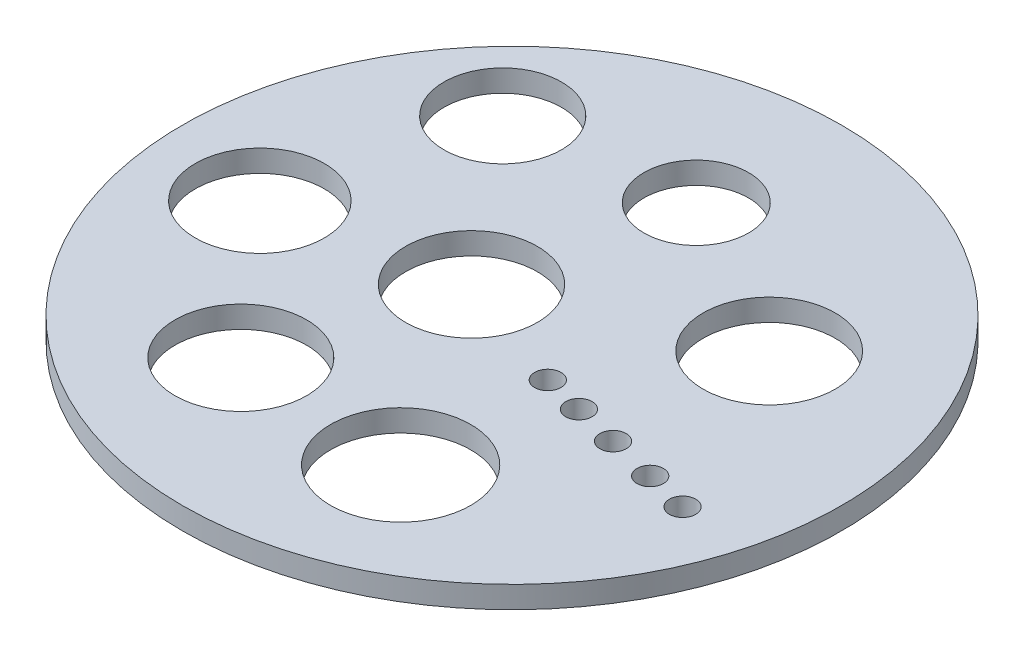
ISO-10303-21;
HEADER;
FILE_DESCRIPTION(('STEP AP214'),'2;1');
FILE_NAME('part.step','',(''),(''),'','','');
FILE_SCHEMA(('AUTOMOTIVE_DESIGN { 1 0 10303 214 1 1 1 1 }'));
ENDSEC;
DATA;
#1=APPLICATION_CONTEXT('core data for automotive mechanical design processes');
#2=APPLICATION_PROTOCOL_DEFINITION('international standard','automotive_design',2000,#1);
#3=PRODUCT_CONTEXT('',#1,'mechanical');
#4=PRODUCT('Part','Part','',(#3));
#5=PRODUCT_RELATED_PRODUCT_CATEGORY('part','',(#4));
#6=PRODUCT_DEFINITION_FORMATION('','',#4);
#7=PRODUCT_DEFINITION_CONTEXT('part definition',#1,'design');
#8=PRODUCT_DEFINITION('design','',#6,#7);
#9=PRODUCT_DEFINITION_SHAPE('','',#8);
#10=(LENGTH_UNIT() NAMED_UNIT(*) SI_UNIT(.MILLI.,.METRE.));
#11=(NAMED_UNIT(*) PLANE_ANGLE_UNIT() SI_UNIT($,.RADIAN.));
#12=(NAMED_UNIT(*) SI_UNIT($,.STERADIAN.) SOLID_ANGLE_UNIT());
#13=UNCERTAINTY_MEASURE_WITH_UNIT(LENGTH_MEASURE(1.E-05),#10,'distance_accuracy_value','');
#14=(GEOMETRIC_REPRESENTATION_CONTEXT(3) GLOBAL_UNCERTAINTY_ASSIGNED_CONTEXT((#13)) GLOBAL_UNIT_ASSIGNED_CONTEXT((#10,
#11,#12)) REPRESENTATION_CONTEXT('',''));
#15=CARTESIAN_POINT('',(0.,0.,0.));
#16=DIRECTION('',(0.,0.,1.));
#17=DIRECTION('',(1.,0.,0.));
#18=AXIS2_PLACEMENT_3D('',#15,#16,#17);
#19=CARTESIAN_POINT('',(-1.20766928586824,1.,-1.22182166031201));
#20=DIRECTION('',(0.,-1.,0.));
#21=DIRECTION('',(0.,0.,-1.));
#22=AXIS2_PLACEMENT_3D('',#19,#20,#21);
#23=CYLINDRICAL_SURFACE('',#22,15.);
#24=CARTESIAN_POINT('',(-1.20766928586824,1.,-1.22182166031201));
#25=DIRECTION('',(0.,1.,0.));
#26=DIRECTION('',(0.,0.,1.));
#27=AXIS2_PLACEMENT_3D('',#24,#25,#26);
#28=CIRCLE('',#27,15.);
#29=CARTESIAN_POINT('',(-1.20766928586824,1.,13.778178339688));
#30=VERTEX_POINT('',#29);
#31=EDGE_CURVE('E10',#30,#30,#28,.T.);
#32=ORIENTED_EDGE('',*,*,#31,.F.);
#33=EDGE_LOOP('',(#32));
#34=FACE_BOUND('',#33,.T.);
#35=CARTESIAN_POINT('',(-1.20766928586824,0.,-1.22182166031201));
#36=DIRECTION('',(0.,1.,0.));
#37=DIRECTION('',(0.,0.,1.));
#38=AXIS2_PLACEMENT_3D('',#35,#36,#37);
#39=CIRCLE('',#38,15.);
#40=CARTESIAN_POINT('',(-1.20766928586824,0.,13.778178339688));
#41=VERTEX_POINT('',#40);
#42=EDGE_CURVE('E40',#41,#41,#39,.T.);
#43=ORIENTED_EDGE('',*,*,#42,.T.);
#44=EDGE_LOOP('',(#43));
#45=FACE_BOUND('',#44,.T.);
#46=ADVANCED_FACE('F37',(#34,#45),#23,.T.);
#47=CARTESIAN_POINT('',(-1.20766928586824,1.,-1.22182166031201));
#48=DIRECTION('',(0.,1.,0.));
#49=DIRECTION('',(0.,0.,1.));
#50=AXIS2_PLACEMENT_3D('',#47,#48,#49);
#51=PLANE('',#50);
#52=CARTESIAN_POINT('',(10.2204807422126,1.,2.44319356089306));
#53=DIRECTION('',(0.,1.,0.));
#54=DIRECTION('',(0.,0.,1.));
#55=AXIS2_PLACEMENT_3D('',#52,#53,#54);
#56=CIRCLE('',#55,0.6);
#57=CARTESIAN_POINT('',(10.2204807422126,1.,3.04319356089306));
#58=VERTEX_POINT('',#57);
#59=EDGE_CURVE('E63',#58,#58,#56,.T.);
#60=ORIENTED_EDGE('',*,*,#59,.F.);
#61=EDGE_LOOP('',(#60));
#62=FACE_BOUND('',#61,.T.);
#63=CARTESIAN_POINT('',(8.27073273049914,1.,1.96563739293445));
#64=DIRECTION('',(0.,1.,0.));
#65=DIRECTION('',(0.,0.,1.));
#66=AXIS2_PLACEMENT_3D('',#63,#64,#65);
#67=CIRCLE('',#66,0.6);
#68=CARTESIAN_POINT('',(8.27073273049914,1.,2.56563739293445));
#69=VERTEX_POINT('',#68);
#70=EDGE_CURVE('E71',#69,#69,#67,.T.);
#71=ORIENTED_EDGE('',*,*,#70,.F.);
#72=EDGE_LOOP('',(#71));
#73=FACE_BOUND('',#72,.T.);
#74=CARTESIAN_POINT('',(6.05224772318341,1.,1.43838820859512));
#75=DIRECTION('',(0.,1.,0.));
#76=DIRECTION('',(0.,0.,1.));
#77=AXIS2_PLACEMENT_3D('',#74,#75,#76);
#78=CIRCLE('',#77,0.6);
#79=CARTESIAN_POINT('',(6.05224772318341,1.,2.03838820859512));
#80=VERTEX_POINT('',#79);
#81=EDGE_CURVE('E79',#80,#80,#78,.T.);
#82=ORIENTED_EDGE('',*,*,#81,.F.);
#83=EDGE_LOOP('',(#82));
#84=FACE_BOUND('',#83,.T.);
#85=CARTESIAN_POINT('',(-1.45057150860595,1.,-9.85142065560751));
#86=DIRECTION('',(0.,1.,0.));
#87=DIRECTION('',(0.,0.,1.));
#88=AXIS2_PLACEMENT_3D('',#85,#86,#87);
#89=CIRCLE('',#88,2.38211714141223);
#90=CARTESIAN_POINT('',(-1.45057150860595,1.,-7.46930351419529));
#91=VERTEX_POINT('',#90);
#92=EDGE_CURVE('E55',#91,#91,#89,.T.);
#93=ORIENTED_EDGE('',*,*,#92,.F.);
#94=EDGE_LOOP('',(#93));
#95=FACE_BOUND('',#94,.T.);
#96=CARTESIAN_POINT('',(-3.34837936382293,1.,-1.51856966447994));
#97=DIRECTION('',(0.,1.,0.));
#98=DIRECTION('',(0.,0.,1.));
#99=AXIS2_PLACEMENT_3D('',#96,#97,#98);
#100=CIRCLE('',#99,3.);
#101=CARTESIAN_POINT('',(-3.34837936382293,1.,1.48143033552006));
#102=VERTEX_POINT('',#101);
#103=EDGE_CURVE('E105',#102,#102,#100,.T.);
#104=ORIENTED_EDGE('',*,*,#103,.F.);
#105=EDGE_LOOP('',(#104));
#106=FACE_BOUND('',#105,.T.);
#107=CARTESIAN_POINT('',(-9.28019272865299,1.,-8.87176725526073));
#108=DIRECTION('',(0.,1.,0.));
#109=DIRECTION('',(0.,0.,1.));
#110=AXIS2_PLACEMENT_3D('',#107,#108,#109);
#111=CIRCLE('',#110,2.67573764730626);
#112=CARTESIAN_POINT('',(-9.28019272865299,1.,-6.19602960795448));
#113=VERTEX_POINT('',#112);
#114=EDGE_CURVE('E97',#113,#113,#111,.T.);
#115=ORIENTED_EDGE('',*,*,#114,.F.);
#116=EDGE_LOOP('',(#115));
#117=FACE_BOUND('',#116,.T.);
#118=CARTESIAN_POINT('',(-11.4636994151454,1.,0.));
#119=DIRECTION('',(0.,1.,0.));
#120=DIRECTION('',(0.,0.,1.));
#121=AXIS2_PLACEMENT_3D('',#118,#119,#120);
#122=CIRCLE('',#121,2.93792985118076);
#123=CARTESIAN_POINT('',(-11.4636994151454,1.,2.93792985118076));
#124=VERTEX_POINT('',#123);
#125=EDGE_CURVE('E88',#124,#124,#122,.T.);
#126=ORIENTED_EDGE('',*,*,#125,.F.);
#127=EDGE_LOOP('',(#126));
#128=FACE_BOUND('',#127,.T.);
#129=CARTESIAN_POINT('',(-5.70639331677292,1.,6.62325407397901));
#130=DIRECTION('',(0.,1.,0.));
#131=DIRECTION('',(0.,0.,1.));
#132=AXIS2_PLACEMENT_3D('',#129,#130,#131);
#133=CIRCLE('',#132,2.99539996151972);
#134=CARTESIAN_POINT('',(-5.70639331677292,1.,9.61865403549873));
#135=VERTEX_POINT('',#134);
#136=EDGE_CURVE('E89',#135,#135,#133,.T.);
#137=ORIENTED_EDGE('',*,*,#136,.F.);
#138=EDGE_LOOP('',(#137));
#139=FACE_BOUND('',#138,.T.);
#140=CARTESIAN_POINT('',(2.15541928730187,1.,7.21019872550954));
#141=DIRECTION('',(0.,1.,0.));
#142=DIRECTION('',(0.,0.,1.));
#143=AXIS2_PLACEMENT_3D('',#140,#141,#142);
#144=CIRCLE('',#143,3.19174632887634);
#145=CARTESIAN_POINT('',(2.15541928730187,1.,10.4019450543859));
#146=VERTEX_POINT('',#145);
#147=EDGE_CURVE('E135',#146,#146,#144,.T.);
#148=ORIENTED_EDGE('',*,*,#147,.F.);
#149=EDGE_LOOP('',(#148));
#150=FACE_BOUND('',#149,.T.);
#151=CARTESIAN_POINT('',(2.15541928730187,1.,0.512260870545261));
#152=DIRECTION('',(0.,1.,0.));
#153=DIRECTION('',(0.,0.,1.));
#154=AXIS2_PLACEMENT_3D('',#151,#152,#153);
#155=CIRCLE('',#154,0.6);
#156=CARTESIAN_POINT('',(2.15541928730187,1.,1.11226087054526));
#157=VERTEX_POINT('',#156);
#158=EDGE_CURVE('E127',#157,#157,#155,.T.);
#159=ORIENTED_EDGE('',*,*,#158,.F.);
#160=EDGE_LOOP('',(#159));
#161=FACE_BOUND('',#160,.T.);
#162=CARTESIAN_POINT('',(4.01494162657677,1.,0.954198333908933));
#163=DIRECTION('',(0.,1.,0.));
#164=DIRECTION('',(0.,0.,1.));
#165=AXIS2_PLACEMENT_3D('',#162,#163,#164);
#166=CIRCLE('',#165,0.6);
#167=CARTESIAN_POINT('',(4.01494162657677,1.,1.55419833390893));
#168=VERTEX_POINT('',#167);
#169=EDGE_CURVE('E119',#168,#168,#166,.T.);
#170=ORIENTED_EDGE('',*,*,#169,.F.);
#171=EDGE_LOOP('',(#170));
#172=FACE_BOUND('',#171,.T.);
#173=CARTESIAN_POINT('',(6.05224772318341,1.,-5.66766654313611));
#174=DIRECTION('',(0.,1.,0.));
#175=DIRECTION('',(0.,0.,1.));
#176=AXIS2_PLACEMENT_3D('',#173,#174,#175);
#177=CIRCLE('',#176,3.00690191665762);
#178=CARTESIAN_POINT('',(6.05224772318341,1.,-2.66076462647849));
#179=VERTEX_POINT('',#178);
#180=EDGE_CURVE('E51',#179,#179,#177,.T.);
#181=ORIENTED_EDGE('',*,*,#180,.F.);
#182=EDGE_LOOP('',(#181));
#183=FACE_BOUND('',#182,.T.);
#184=ORIENTED_EDGE('',*,*,#31,.T.);
#185=EDGE_LOOP('',(#184));
#186=FACE_BOUND('',#185,.T.);
#187=ADVANCED_FACE('F149',(#62,#73,#84,#95,#106,#117,#128,#139,#150,#161,#172,#183,#186),#51,.T.);
#188=CARTESIAN_POINT('',(-1.20766928586824,0.,-1.22182166031201));
#189=DIRECTION('',(0.,1.,0.));
#190=DIRECTION('',(0.,0.,1.));
#191=AXIS2_PLACEMENT_3D('',#188,#189,#190);
#192=PLANE('',#191);
#193=CARTESIAN_POINT('',(10.2204807422126,0.,2.44319356089306));
#194=DIRECTION('',(0.,1.,0.));
#195=DIRECTION('',(0.,0.,1.));
#196=AXIS2_PLACEMENT_3D('',#193,#194,#195);
#197=CIRCLE('',#196,0.6);
#198=CARTESIAN_POINT('',(10.2204807422126,0.,3.04319356089306));
#199=VERTEX_POINT('',#198);
#200=EDGE_CURVE('E59',#199,#199,#197,.T.);
#201=ORIENTED_EDGE('',*,*,#200,.T.);
#202=EDGE_LOOP('',(#201));
#203=FACE_BOUND('',#202,.T.);
#204=CARTESIAN_POINT('',(8.27073273049914,0.,1.96563739293445));
#205=DIRECTION('',(0.,1.,0.));
#206=DIRECTION('',(0.,0.,1.));
#207=AXIS2_PLACEMENT_3D('',#204,#205,#206);
#208=CIRCLE('',#207,0.6);
#209=CARTESIAN_POINT('',(8.27073273049914,0.,2.56563739293445));
#210=VERTEX_POINT('',#209);
#211=EDGE_CURVE('E67',#210,#210,#208,.T.);
#212=ORIENTED_EDGE('',*,*,#211,.T.);
#213=EDGE_LOOP('',(#212));
#214=FACE_BOUND('',#213,.T.);
#215=CARTESIAN_POINT('',(6.05224772318341,0.,1.43838820859512));
#216=DIRECTION('',(0.,1.,0.));
#217=DIRECTION('',(0.,0.,1.));
#218=AXIS2_PLACEMENT_3D('',#215,#216,#217);
#219=CIRCLE('',#218,0.6);
#220=CARTESIAN_POINT('',(6.05224772318341,0.,2.03838820859512));
#221=VERTEX_POINT('',#220);
#222=EDGE_CURVE('E75',#221,#221,#219,.T.);
#223=ORIENTED_EDGE('',*,*,#222,.T.);
#224=EDGE_LOOP('',(#223));
#225=FACE_BOUND('',#224,.T.);
#226=CARTESIAN_POINT('',(-1.45057150860595,0.,-9.85142065560751));
#227=DIRECTION('',(0.,1.,0.));
#228=DIRECTION('',(0.,0.,1.));
#229=AXIS2_PLACEMENT_3D('',#226,#227,#228);
#230=CIRCLE('',#229,2.38211714141223);
#231=CARTESIAN_POINT('',(-1.45057150860595,0.,-7.46930351419529));
#232=VERTEX_POINT('',#231);
#233=EDGE_CURVE('E109',#232,#232,#230,.T.);
#234=ORIENTED_EDGE('',*,*,#233,.T.);
#235=EDGE_LOOP('',(#234));
#236=FACE_BOUND('',#235,.T.);
#237=CARTESIAN_POINT('',(-3.34837936382293,0.,-1.51856966447994));
#238=DIRECTION('',(0.,1.,0.));
#239=DIRECTION('',(0.,0.,1.));
#240=AXIS2_PLACEMENT_3D('',#237,#238,#239);
#241=CIRCLE('',#240,3.);
#242=CARTESIAN_POINT('',(-3.34837936382293,0.,1.48143033552006));
#243=VERTEX_POINT('',#242);
#244=EDGE_CURVE('E101',#243,#243,#241,.T.);
#245=ORIENTED_EDGE('',*,*,#244,.T.);
#246=EDGE_LOOP('',(#245));
#247=FACE_BOUND('',#246,.T.);
#248=CARTESIAN_POINT('',(-9.28019272865299,0.,-8.87176725526073));
#249=DIRECTION('',(0.,1.,0.));
#250=DIRECTION('',(0.,0.,1.));
#251=AXIS2_PLACEMENT_3D('',#248,#249,#250);
#252=CIRCLE('',#251,2.67573764730626);
#253=CARTESIAN_POINT('',(-9.28019272865299,0.,-6.19602960795448));
#254=VERTEX_POINT('',#253);
#255=EDGE_CURVE('E93',#254,#254,#252,.T.);
#256=ORIENTED_EDGE('',*,*,#255,.T.);
#257=EDGE_LOOP('',(#256));
#258=FACE_BOUND('',#257,.T.);
#259=CARTESIAN_POINT('',(-11.4636994151454,0.,0.));
#260=DIRECTION('',(0.,1.,0.));
#261=DIRECTION('',(0.,0.,1.));
#262=AXIS2_PLACEMENT_3D('',#259,#260,#261);
#263=CIRCLE('',#262,2.93792985118076);
#264=CARTESIAN_POINT('',(-11.4636994151454,0.,2.93792985118076));
#265=VERTEX_POINT('',#264);
#266=EDGE_CURVE('E84',#265,#265,#263,.T.);
#267=ORIENTED_EDGE('',*,*,#266,.T.);
#268=EDGE_LOOP('',(#267));
#269=FACE_BOUND('',#268,.T.);
#270=CARTESIAN_POINT('',(-5.70639331677292,0.,6.62325407397901));
#271=DIRECTION('',(0.,1.,0.));
#272=DIRECTION('',(0.,0.,1.));
#273=AXIS2_PLACEMENT_3D('',#270,#271,#272);
#274=CIRCLE('',#273,2.99539996151972);
#275=CARTESIAN_POINT('',(-5.70639331677292,0.,9.61865403549873));
#276=VERTEX_POINT('',#275);
#277=EDGE_CURVE('E139',#276,#276,#274,.T.);
#278=ORIENTED_EDGE('',*,*,#277,.T.);
#279=EDGE_LOOP('',(#278));
#280=FACE_BOUND('',#279,.T.);
#281=CARTESIAN_POINT('',(2.15541928730187,0.,7.21019872550954));
#282=DIRECTION('',(0.,1.,0.));
#283=DIRECTION('',(0.,0.,1.));
#284=AXIS2_PLACEMENT_3D('',#281,#282,#283);
#285=CIRCLE('',#284,3.19174632887634);
#286=CARTESIAN_POINT('',(2.15541928730187,0.,10.4019450543859));
#287=VERTEX_POINT('',#286);
#288=EDGE_CURVE('E131',#287,#287,#285,.T.);
#289=ORIENTED_EDGE('',*,*,#288,.T.);
#290=EDGE_LOOP('',(#289));
#291=FACE_BOUND('',#290,.T.);
#292=CARTESIAN_POINT('',(2.15541928730187,0.,0.512260870545261));
#293=DIRECTION('',(0.,1.,0.));
#294=DIRECTION('',(0.,0.,1.));
#295=AXIS2_PLACEMENT_3D('',#292,#293,#294);
#296=CIRCLE('',#295,0.6);
#297=CARTESIAN_POINT('',(2.15541928730187,0.,1.11226087054526));
#298=VERTEX_POINT('',#297);
#299=EDGE_CURVE('E123',#298,#298,#296,.T.);
#300=ORIENTED_EDGE('',*,*,#299,.T.);
#301=EDGE_LOOP('',(#300));
#302=FACE_BOUND('',#301,.T.);
#303=CARTESIAN_POINT('',(4.01494162657677,0.,0.954198333908933));
#304=DIRECTION('',(0.,1.,0.));
#305=DIRECTION('',(0.,0.,1.));
#306=AXIS2_PLACEMENT_3D('',#303,#304,#305);
#307=CIRCLE('',#306,0.6);
#308=CARTESIAN_POINT('',(4.01494162657677,0.,1.55419833390893));
#309=VERTEX_POINT('',#308);
#310=EDGE_CURVE('E83',#309,#309,#307,.T.);
#311=ORIENTED_EDGE('',*,*,#310,.T.);
#312=EDGE_LOOP('',(#311));
#313=FACE_BOUND('',#312,.T.);
#314=CARTESIAN_POINT('',(6.05224772318341,0.,-5.66766654313611));
#315=DIRECTION('',(0.,1.,0.));
#316=DIRECTION('',(0.,0.,1.));
#317=AXIS2_PLACEMENT_3D('',#314,#315,#316);
#318=CIRCLE('',#317,3.00690191665762);
#319=CARTESIAN_POINT('',(6.05224772318341,0.,-2.66076462647849));
#320=VERTEX_POINT('',#319);
#321=EDGE_CURVE('E49',#320,#320,#318,.T.);
#322=ORIENTED_EDGE('',*,*,#321,.T.);
#323=EDGE_LOOP('',(#322));
#324=FACE_BOUND('',#323,.T.);
#325=ORIENTED_EDGE('',*,*,#42,.F.);
#326=EDGE_LOOP('',(#325));
#327=FACE_BOUND('',#326,.T.);
#328=ADVANCED_FACE('F152',(#203,#214,#225,#236,#247,#258,#269,#280,#291,#302,#313,#324,#327),
#192,.F.);
#329=CARTESIAN_POINT('',(6.05224772318341,0.,-5.66766654313611));
#330=DIRECTION('',(0.,1.,0.));
#331=DIRECTION('',(0.,0.,1.));
#332=AXIS2_PLACEMENT_3D('',#329,#330,#331);
#333=CYLINDRICAL_SURFACE('',#332,3.00690191665762);
#334=ORIENTED_EDGE('',*,*,#321,.F.);
#335=EDGE_LOOP('',(#334));
#336=FACE_BOUND('',#335,.T.);
#337=ORIENTED_EDGE('',*,*,#180,.T.);
#338=EDGE_LOOP('',(#337));
#339=FACE_BOUND('',#338,.T.);
#340=ADVANCED_FACE('F163',(#336,#339),#333,.F.);
#341=CARTESIAN_POINT('',(4.01494162657677,0.,0.954198333908933));
#342=DIRECTION('',(0.,1.,0.));
#343=DIRECTION('',(0.,0.,1.));
#344=AXIS2_PLACEMENT_3D('',#341,#342,#343);
#345=CYLINDRICAL_SURFACE('',#344,0.6);
#346=ORIENTED_EDGE('',*,*,#310,.F.);
#347=EDGE_LOOP('',(#346));
#348=FACE_BOUND('',#347,.T.);
#349=ORIENTED_EDGE('',*,*,#169,.T.);
#350=EDGE_LOOP('',(#349));
#351=FACE_BOUND('',#350,.T.);
#352=ADVANCED_FACE('F165',(#348,#351),#345,.F.);
#353=CARTESIAN_POINT('',(2.15541928730187,0.,0.512260870545261));
#354=DIRECTION('',(0.,1.,0.));
#355=DIRECTION('',(0.,0.,1.));
#356=AXIS2_PLACEMENT_3D('',#353,#354,#355);
#357=CYLINDRICAL_SURFACE('',#356,0.6);
#358=ORIENTED_EDGE('',*,*,#299,.F.);
#359=EDGE_LOOP('',(#358));
#360=FACE_BOUND('',#359,.T.);
#361=ORIENTED_EDGE('',*,*,#158,.T.);
#362=EDGE_LOOP('',(#361));
#363=FACE_BOUND('',#362,.T.);
#364=ADVANCED_FACE('F172',(#360,#363),#357,.F.);
#365=CARTESIAN_POINT('',(2.15541928730187,0.,7.21019872550954));
#366=DIRECTION('',(0.,1.,0.));
#367=DIRECTION('',(0.,0.,1.));
#368=AXIS2_PLACEMENT_3D('',#365,#366,#367);
#369=CYLINDRICAL_SURFACE('',#368,3.19174632887634);
#370=ORIENTED_EDGE('',*,*,#288,.F.);
#371=EDGE_LOOP('',(#370));
#372=FACE_BOUND('',#371,.T.);
#373=ORIENTED_EDGE('',*,*,#147,.T.);
#374=EDGE_LOOP('',(#373));
#375=FACE_BOUND('',#374,.T.);
#376=ADVANCED_FACE('F212',(#372,#375),#369,.F.);
#377=CARTESIAN_POINT('',(-5.70639331677292,0.,6.62325407397901));
#378=DIRECTION('',(0.,1.,0.));
#379=DIRECTION('',(0.,0.,1.));
#380=AXIS2_PLACEMENT_3D('',#377,#378,#379);
#381=CYLINDRICAL_SURFACE('',#380,2.99539996151972);
#382=ORIENTED_EDGE('',*,*,#277,.F.);
#383=EDGE_LOOP('',(#382));
#384=FACE_BOUND('',#383,.T.);
#385=ORIENTED_EDGE('',*,*,#136,.T.);
#386=EDGE_LOOP('',(#385));
#387=FACE_BOUND('',#386,.T.);
#388=ADVANCED_FACE('F147',(#384,#387),#381,.F.);
#389=CARTESIAN_POINT('',(-11.4636994151454,0.,0.));
#390=DIRECTION('',(0.,1.,0.));
#391=DIRECTION('',(0.,0.,1.));
#392=AXIS2_PLACEMENT_3D('',#389,#390,#391);
#393=CYLINDRICAL_SURFACE('',#392,2.93792985118076);
#394=ORIENTED_EDGE('',*,*,#266,.F.);
#395=EDGE_LOOP('',(#394));
#396=FACE_BOUND('',#395,.T.);
#397=ORIENTED_EDGE('',*,*,#125,.T.);
#398=EDGE_LOOP('',(#397));
#399=FACE_BOUND('',#398,.T.);
#400=ADVANCED_FACE('F231',(#396,#399),#393,.F.);
#401=CARTESIAN_POINT('',(-9.28019272865299,0.,-8.87176725526073));
#402=DIRECTION('',(0.,1.,0.));
#403=DIRECTION('',(0.,0.,1.));
#404=AXIS2_PLACEMENT_3D('',#401,#402,#403);
#405=CYLINDRICAL_SURFACE('',#404,2.67573764730626);
#406=ORIENTED_EDGE('',*,*,#255,.F.);
#407=EDGE_LOOP('',(#406));
#408=FACE_BOUND('',#407,.T.);
#409=ORIENTED_EDGE('',*,*,#114,.T.);
#410=EDGE_LOOP('',(#409));
#411=FACE_BOUND('',#410,.T.);
#412=ADVANCED_FACE('F241',(#408,#411),#405,.F.);
#413=CARTESIAN_POINT('',(-3.34837936382293,0.,-1.51856966447994));
#414=DIRECTION('',(0.,1.,0.));
#415=DIRECTION('',(0.,0.,1.));
#416=AXIS2_PLACEMENT_3D('',#413,#414,#415);
#417=CYLINDRICAL_SURFACE('',#416,3.);
#418=ORIENTED_EDGE('',*,*,#244,.F.);
#419=EDGE_LOOP('',(#418));
#420=FACE_BOUND('',#419,.T.);
#421=ORIENTED_EDGE('',*,*,#103,.T.);
#422=EDGE_LOOP('',(#421));
#423=FACE_BOUND('',#422,.T.);
#424=ADVANCED_FACE('F251',(#420,#423),#417,.F.);
#425=CARTESIAN_POINT('',(-1.45057150860595,0.,-9.85142065560751));
#426=DIRECTION('',(0.,1.,0.));
#427=DIRECTION('',(0.,0.,1.));
#428=AXIS2_PLACEMENT_3D('',#425,#426,#427);
#429=CYLINDRICAL_SURFACE('',#428,2.38211714141223);
#430=ORIENTED_EDGE('',*,*,#233,.F.);
#431=EDGE_LOOP('',(#430));
#432=FACE_BOUND('',#431,.T.);
#433=ORIENTED_EDGE('',*,*,#92,.T.);
#434=EDGE_LOOP('',(#433));
#435=FACE_BOUND('',#434,.T.);
#436=ADVANCED_FACE('F261',(#432,#435),#429,.F.);
#437=CARTESIAN_POINT('',(6.05224772318341,0.,1.43838820859512));
#438=DIRECTION('',(0.,1.,0.));
#439=DIRECTION('',(0.,0.,1.));
#440=AXIS2_PLACEMENT_3D('',#437,#438,#439);
#441=CYLINDRICAL_SURFACE('',#440,0.6);
#442=ORIENTED_EDGE('',*,*,#222,.F.);
#443=EDGE_LOOP('',(#442));
#444=FACE_BOUND('',#443,.T.);
#445=ORIENTED_EDGE('',*,*,#81,.T.);
#446=EDGE_LOOP('',(#445));
#447=FACE_BOUND('',#446,.T.);
#448=ADVANCED_FACE('F271',(#444,#447),#441,.F.);
#449=CARTESIAN_POINT('',(8.27073273049914,0.,1.96563739293445));
#450=DIRECTION('',(0.,1.,0.));
#451=DIRECTION('',(0.,0.,1.));
#452=AXIS2_PLACEMENT_3D('',#449,#450,#451);
#453=CYLINDRICAL_SURFACE('',#452,0.6);
#454=ORIENTED_EDGE('',*,*,#211,.F.);
#455=EDGE_LOOP('',(#454));
#456=FACE_BOUND('',#455,.T.);
#457=ORIENTED_EDGE('',*,*,#70,.T.);
#458=EDGE_LOOP('',(#457));
#459=FACE_BOUND('',#458,.T.);
#460=ADVANCED_FACE('F281',(#456,#459),#453,.F.);
#461=CARTESIAN_POINT('',(10.2204807422126,0.,2.44319356089306));
#462=DIRECTION('',(0.,1.,0.));
#463=DIRECTION('',(0.,0.,1.));
#464=AXIS2_PLACEMENT_3D('',#461,#462,#463);
#465=CYLINDRICAL_SURFACE('',#464,0.6);
#466=ORIENTED_EDGE('',*,*,#200,.F.);
#467=EDGE_LOOP('',(#466));
#468=FACE_BOUND('',#467,.T.);
#469=ORIENTED_EDGE('',*,*,#59,.T.);
#470=EDGE_LOOP('',(#469));
#471=FACE_BOUND('',#470,.T.);
#472=ADVANCED_FACE('F291',(#468,#471),#465,.F.);
#473=CLOSED_SHELL('',(#46,#187,#328,#340,#352,#364,#376,#388,#400,#412,#424,#436,#448,#460,#472));
#474=MANIFOLD_SOLID_BREP('B2',#473);
#475=ADVANCED_BREP_SHAPE_REPRESENTATION('',(#18,#474),#14);
#476=SHAPE_DEFINITION_REPRESENTATION(#9,#475);
ENDSEC;
END-ISO-10303-21;
